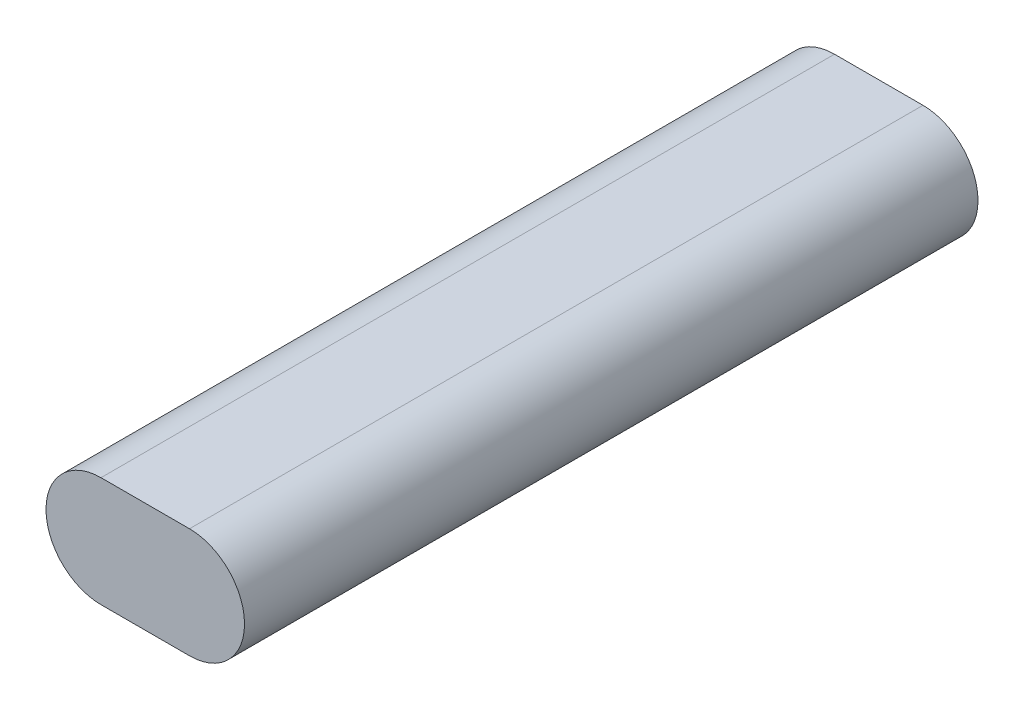
ISO-10303-21;
HEADER;
FILE_DESCRIPTION(('STEP AP214'),'2;1');
FILE_NAME('part.step','',(''),(''),'','','');
FILE_SCHEMA(('AUTOMOTIVE_DESIGN { 1 0 10303 214 1 1 1 1 }'));
ENDSEC;
DATA;
#1=APPLICATION_CONTEXT('core data for automotive mechanical design processes');
#2=APPLICATION_PROTOCOL_DEFINITION('international standard','automotive_design',2000,#1);
#3=PRODUCT_CONTEXT('',#1,'mechanical');
#4=PRODUCT('Part','Part','',(#3));
#5=PRODUCT_RELATED_PRODUCT_CATEGORY('part','',(#4));
#6=PRODUCT_DEFINITION_FORMATION('','',#4);
#7=PRODUCT_DEFINITION_CONTEXT('part definition',#1,'design');
#8=PRODUCT_DEFINITION('design','',#6,#7);
#9=PRODUCT_DEFINITION_SHAPE('','',#8);
#10=(LENGTH_UNIT() NAMED_UNIT(*) SI_UNIT(.MILLI.,.METRE.));
#11=(NAMED_UNIT(*) PLANE_ANGLE_UNIT() SI_UNIT($,.RADIAN.));
#12=(NAMED_UNIT(*) SI_UNIT($,.STERADIAN.) SOLID_ANGLE_UNIT());
#13=UNCERTAINTY_MEASURE_WITH_UNIT(LENGTH_MEASURE(1.E-05),#10,'distance_accuracy_value','');
#14=(GEOMETRIC_REPRESENTATION_CONTEXT(3) GLOBAL_UNCERTAINTY_ASSIGNED_CONTEXT((#13)) GLOBAL_UNIT_ASSIGNED_CONTEXT((#10,
#11,#12)) REPRESENTATION_CONTEXT('',''));
#15=CARTESIAN_POINT('',(0.,0.,0.));
#16=DIRECTION('',(0.,0.,1.));
#17=DIRECTION('',(1.,0.,0.));
#18=AXIS2_PLACEMENT_3D('',#15,#16,#17);
#19=CARTESIAN_POINT('',(-6.575,0.,109.));
#20=DIRECTION('',(0.,0.,-1.));
#21=DIRECTION('',(-1.,0.,0.));
#22=AXIS2_PLACEMENT_3D('',#19,#20,#21);
#23=CYLINDRICAL_SURFACE('',#22,8.175);
#24=CARTESIAN_POINT('',(-6.575,0.,0.));
#25=DIRECTION('',(0.,0.,1.));
#26=DIRECTION('',(1.,0.,0.));
#27=AXIS2_PLACEMENT_3D('',#24,#25,#26);
#28=CIRCLE('',#27,8.175);
#29=CARTESIAN_POINT('',(-6.575,8.175,0.));
#30=VERTEX_POINT('',#29);
#31=CARTESIAN_POINT('',(-6.575,-8.175,0.));
#32=VERTEX_POINT('',#31);
#33=EDGE_CURVE('E96',#30,#32,#28,.T.);
#34=ORIENTED_EDGE('',*,*,#33,.T.);
#35=DIRECTION('',(0.,0.,-1.));
#36=VECTOR('',#35,1.);
#37=CARTESIAN_POINT('',(-6.575,-8.175,109.));
#38=LINE('',#37,#36);
#39=CARTESIAN_POINT('',(-6.575,-8.175,109.));
#40=VERTEX_POINT('',#39);
#41=EDGE_CURVE('E11',#40,#32,#38,.T.);
#42=ORIENTED_EDGE('',*,*,#41,.F.);
#43=CARTESIAN_POINT('',(-6.575,0.,109.));
#44=DIRECTION('',(0.,0.,1.));
#45=DIRECTION('',(1.,0.,0.));
#46=AXIS2_PLACEMENT_3D('',#43,#44,#45);
#47=CIRCLE('',#46,8.175);
#48=CARTESIAN_POINT('',(-6.575,8.175,109.));
#49=VERTEX_POINT('',#48);
#50=EDGE_CURVE('E84',#49,#40,#47,.T.);
#51=ORIENTED_EDGE('',*,*,#50,.F.);
#52=DIRECTION('',(0.,0.,-1.));
#53=VECTOR('',#52,1.);
#54=CARTESIAN_POINT('',(-6.575,8.175,109.));
#55=LINE('',#54,#53);
#56=EDGE_CURVE('E92',#49,#30,#55,.T.);
#57=ORIENTED_EDGE('',*,*,#56,.T.);
#58=EDGE_LOOP('',(#34,#42,#51,#57));
#59=FACE_BOUND('',#58,.T.);
#60=ADVANCED_FACE('F33',(#59),#23,.T.);
#61=CARTESIAN_POINT('',(-6.575,-8.175,109.));
#62=DIRECTION('',(0.,1.,0.));
#63=DIRECTION('',(0.,0.,1.));
#64=AXIS2_PLACEMENT_3D('',#61,#62,#63);
#65=PLANE('',#64);
#66=DIRECTION('',(1.,0.,0.));
#67=VECTOR('',#66,1.);
#68=CARTESIAN_POINT('',(-6.575,-8.175,0.));
#69=LINE('',#68,#67);
#70=CARTESIAN_POINT('',(6.575,-8.175,0.));
#71=VERTEX_POINT('',#70);
#72=EDGE_CURVE('E88',#32,#71,#69,.T.);
#73=ORIENTED_EDGE('',*,*,#72,.T.);
#74=DIRECTION('',(0.,0.,-1.));
#75=VECTOR('',#74,1.);
#76=CARTESIAN_POINT('',(6.575,-8.175,109.));
#77=LINE('',#76,#75);
#78=CARTESIAN_POINT('',(6.575,-8.175,109.));
#79=VERTEX_POINT('',#78);
#80=EDGE_CURVE('E41',#79,#71,#77,.T.);
#81=ORIENTED_EDGE('',*,*,#80,.F.);
#82=DIRECTION('',(1.,0.,0.));
#83=VECTOR('',#82,1.);
#84=CARTESIAN_POINT('',(-6.575,-8.175,109.));
#85=LINE('',#84,#83);
#86=EDGE_CURVE('E79',#40,#79,#85,.T.);
#87=ORIENTED_EDGE('',*,*,#86,.F.);
#88=ORIENTED_EDGE('',*,*,#41,.T.);
#89=EDGE_LOOP('',(#73,#81,#87,#88));
#90=FACE_BOUND('',#89,.T.);
#91=ADVANCED_FACE('F87',(#90),#65,.F.);
#92=CARTESIAN_POINT('',(6.575,0.,109.));
#93=DIRECTION('',(0.,0.,-1.));
#94=DIRECTION('',(-1.,0.,0.));
#95=AXIS2_PLACEMENT_3D('',#92,#93,#94);
#96=CYLINDRICAL_SURFACE('',#95,8.175);
#97=CARTESIAN_POINT('',(6.575,0.,0.));
#98=DIRECTION('',(0.,0.,1.));
#99=DIRECTION('',(1.,0.,0.));
#100=AXIS2_PLACEMENT_3D('',#97,#98,#99);
#101=CIRCLE('',#100,8.175);
#102=CARTESIAN_POINT('',(6.575,8.175,0.));
#103=VERTEX_POINT('',#102);
#104=EDGE_CURVE('E66',#71,#103,#101,.T.);
#105=ORIENTED_EDGE('',*,*,#104,.T.);
#106=DIRECTION('',(0.,0.,-1.));
#107=VECTOR('',#106,1.);
#108=CARTESIAN_POINT('',(6.575,8.175,109.));
#109=LINE('',#108,#107);
#110=CARTESIAN_POINT('',(6.575,8.175,109.));
#111=VERTEX_POINT('',#110);
#112=EDGE_CURVE('E89',#111,#103,#109,.T.);
#113=ORIENTED_EDGE('',*,*,#112,.F.);
#114=CARTESIAN_POINT('',(6.575,0.,109.));
#115=DIRECTION('',(0.,0.,1.));
#116=DIRECTION('',(1.,0.,0.));
#117=AXIS2_PLACEMENT_3D('',#114,#115,#116);
#118=CIRCLE('',#117,8.175);
#119=EDGE_CURVE('E82',#79,#111,#118,.T.);
#120=ORIENTED_EDGE('',*,*,#119,.F.);
#121=ORIENTED_EDGE('',*,*,#80,.T.);
#122=EDGE_LOOP('',(#105,#113,#120,#121));
#123=FACE_BOUND('',#122,.T.);
#124=ADVANCED_FACE('F90',(#123),#96,.T.);
#125=CARTESIAN_POINT('',(-6.575,8.175,109.));
#126=DIRECTION('',(0.,-1.,0.));
#127=DIRECTION('',(0.,0.,-1.));
#128=AXIS2_PLACEMENT_3D('',#125,#126,#127);
#129=PLANE('',#128);
#130=DIRECTION('',(-1.,0.,0.));
#131=VECTOR('',#130,1.);
#132=CARTESIAN_POINT('',(-6.575,8.175,0.));
#133=LINE('',#132,#131);
#134=EDGE_CURVE('E72',#103,#30,#133,.T.);
#135=ORIENTED_EDGE('',*,*,#134,.T.);
#136=ORIENTED_EDGE('',*,*,#56,.F.);
#137=DIRECTION('',(-1.,0.,0.));
#138=VECTOR('',#137,1.);
#139=CARTESIAN_POINT('',(-6.575,8.175,109.));
#140=LINE('',#139,#138);
#141=EDGE_CURVE('E49',#111,#49,#140,.T.);
#142=ORIENTED_EDGE('',*,*,#141,.F.);
#143=ORIENTED_EDGE('',*,*,#112,.T.);
#144=EDGE_LOOP('',(#135,#136,#142,#143));
#145=FACE_BOUND('',#144,.T.);
#146=ADVANCED_FACE('F103',(#145),#129,.F.);
#147=CARTESIAN_POINT('',(-6.575,0.,109.));
#148=DIRECTION('',(0.,0.,1.));
#149=DIRECTION('',(1.,0.,0.));
#150=AXIS2_PLACEMENT_3D('',#147,#148,#149);
#151=PLANE('',#150);
#152=ORIENTED_EDGE('',*,*,#50,.T.);
#153=ORIENTED_EDGE('',*,*,#86,.T.);
#154=ORIENTED_EDGE('',*,*,#119,.T.);
#155=ORIENTED_EDGE('',*,*,#141,.T.);
#156=EDGE_LOOP('',(#152,#153,#154,#155));
#157=FACE_BOUND('',#156,.T.);
#158=ADVANCED_FACE('F80',(#157),#151,.T.);
#159=CARTESIAN_POINT('',(-6.575,0.,0.));
#160=DIRECTION('',(0.,0.,1.));
#161=DIRECTION('',(1.,0.,0.));
#162=AXIS2_PLACEMENT_3D('',#159,#160,#161);
#163=PLANE('',#162);
#164=ORIENTED_EDGE('',*,*,#33,.F.);
#165=ORIENTED_EDGE('',*,*,#134,.F.);
#166=ORIENTED_EDGE('',*,*,#104,.F.);
#167=ORIENTED_EDGE('',*,*,#72,.F.);
#168=EDGE_LOOP('',(#164,#165,#166,#167));
#169=FACE_BOUND('',#168,.T.);
#170=ADVANCED_FACE('F106',(#169),#163,.F.);
#171=CLOSED_SHELL('',(#60,#91,#124,#146,#158,#170));
#172=MANIFOLD_SOLID_BREP('B2',#171);
#173=ADVANCED_BREP_SHAPE_REPRESENTATION('',(#18,#172),#14);
#174=SHAPE_DEFINITION_REPRESENTATION(#9,#173);
ENDSEC;
END-ISO-10303-21;
